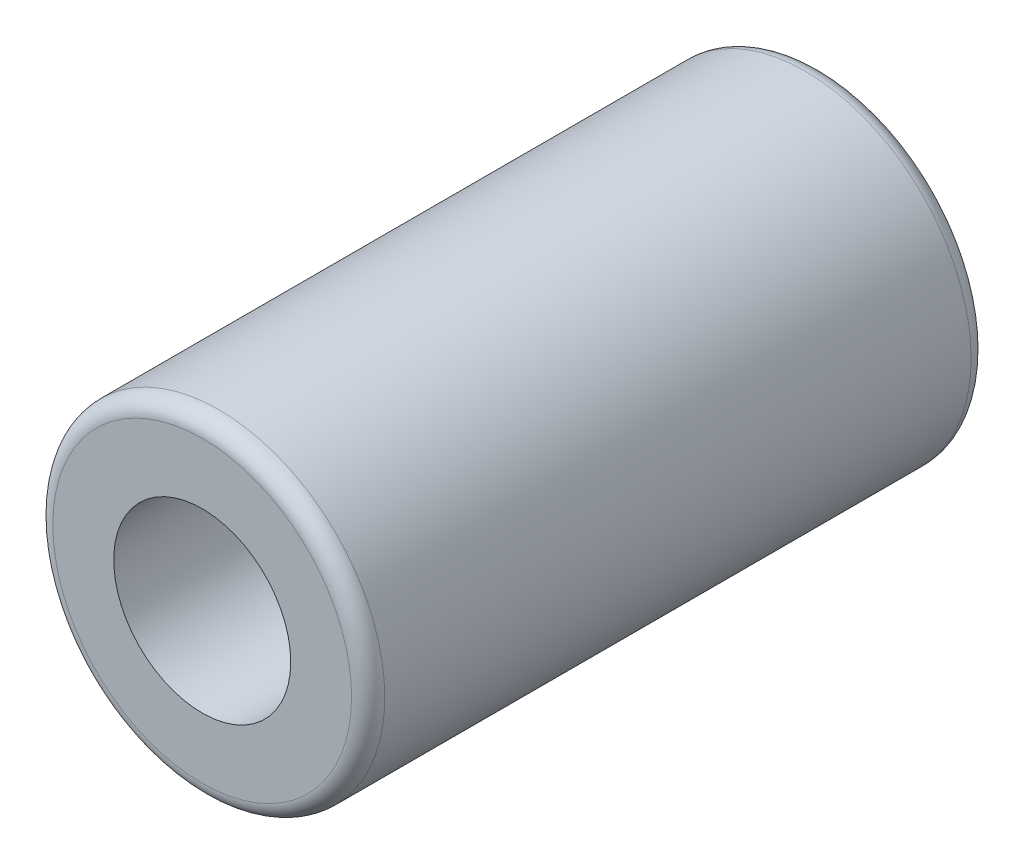
ISO-10303-21;
HEADER;
FILE_DESCRIPTION(('STEP AP214'),'2;1');
FILE_NAME('part.step','',(''),(''),'','','');
FILE_SCHEMA(('AUTOMOTIVE_DESIGN { 1 0 10303 214 1 1 1 1 }'));
ENDSEC;
DATA;
#1=APPLICATION_CONTEXT('core data for automotive mechanical design processes');
#2=APPLICATION_PROTOCOL_DEFINITION('international standard','automotive_design',2000,#1);
#3=PRODUCT_CONTEXT('',#1,'mechanical');
#4=PRODUCT('Part','Part','',(#3));
#5=PRODUCT_RELATED_PRODUCT_CATEGORY('part','',(#4));
#6=PRODUCT_DEFINITION_FORMATION('','',#4);
#7=PRODUCT_DEFINITION_CONTEXT('part definition',#1,'design');
#8=PRODUCT_DEFINITION('design','',#6,#7);
#9=PRODUCT_DEFINITION_SHAPE('','',#8);
#10=(LENGTH_UNIT() NAMED_UNIT(*) SI_UNIT(.MILLI.,.METRE.));
#11=(NAMED_UNIT(*) PLANE_ANGLE_UNIT() SI_UNIT($,.RADIAN.));
#12=(NAMED_UNIT(*) SI_UNIT($,.STERADIAN.) SOLID_ANGLE_UNIT());
#13=UNCERTAINTY_MEASURE_WITH_UNIT(LENGTH_MEASURE(1.E-05),#10,'distance_accuracy_value','');
#14=(GEOMETRIC_REPRESENTATION_CONTEXT(3) GLOBAL_UNCERTAINTY_ASSIGNED_CONTEXT((#13)) GLOBAL_UNIT_ASSIGNED_CONTEXT((#10,
#11,#12)) REPRESENTATION_CONTEXT('',''));
#15=CARTESIAN_POINT('',(0.,0.,0.));
#16=DIRECTION('',(0.,0.,1.));
#17=DIRECTION('',(1.,0.,0.));
#18=AXIS2_PLACEMENT_3D('',#15,#16,#17);
#19=CARTESIAN_POINT('',(0.,0.,11.2));
#20=DIRECTION('',(0.,0.,1.));
#21=DIRECTION('',(1.,0.,0.));
#22=AXIS2_PLACEMENT_3D('',#19,#20,#21);
#23=PLANE('',#22);
#24=CARTESIAN_POINT('',(0.,0.,11.2));
#25=DIRECTION('',(0.,0.,1.));
#26=DIRECTION('',(1.,0.,0.));
#27=AXIS2_PLACEMENT_3D('',#24,#25,#26);
#28=CIRCLE('',#27,2.7);
#29=CARTESIAN_POINT('',(2.7,0.,11.2));
#30=VERTEX_POINT('',#29);
#31=EDGE_CURVE('E10',#30,#30,#28,.T.);
#32=ORIENTED_EDGE('',*,*,#31,.T.);
#33=EDGE_LOOP('',(#32));
#34=FACE_BOUND('',#33,.T.);
#35=CARTESIAN_POINT('',(0.,0.,11.2));
#36=DIRECTION('',(0.,0.,1.));
#37=DIRECTION('',(1.,0.,0.));
#38=AXIS2_PLACEMENT_3D('',#35,#36,#37);
#39=CIRCLE('',#38,1.6);
#40=CARTESIAN_POINT('',(1.6,0.,11.2));
#41=VERTEX_POINT('',#40);
#42=EDGE_CURVE('E50',#41,#41,#39,.T.);
#43=ORIENTED_EDGE('',*,*,#42,.F.);
#44=EDGE_LOOP('',(#43));
#45=FACE_BOUND('',#44,.T.);
#46=ADVANCED_FACE('F30',(#34,#45),#23,.T.);
#47=CARTESIAN_POINT('',(0.,0.,0.));
#48=DIRECTION('',(0.,0.,1.));
#49=DIRECTION('',(1.,0.,0.));
#50=AXIS2_PLACEMENT_3D('',#47,#48,#49);
#51=PLANE('',#50);
#52=CARTESIAN_POINT('',(0.,0.,0.));
#53=DIRECTION('',(0.,0.,1.));
#54=DIRECTION('',(1.,0.,0.));
#55=AXIS2_PLACEMENT_3D('',#52,#53,#54);
#56=CIRCLE('',#55,2.7);
#57=CARTESIAN_POINT('',(2.7,0.,0.));
#58=VERTEX_POINT('',#57);
#59=EDGE_CURVE('E37',#58,#58,#56,.F.);
#60=ORIENTED_EDGE('',*,*,#59,.T.);
#61=EDGE_LOOP('',(#60));
#62=FACE_BOUND('',#61,.T.);
#63=CARTESIAN_POINT('',(0.,0.,0.));
#64=DIRECTION('',(0.,0.,1.));
#65=DIRECTION('',(1.,0.,0.));
#66=AXIS2_PLACEMENT_3D('',#63,#64,#65);
#67=CIRCLE('',#66,1.6);
#68=CARTESIAN_POINT('',(1.6,0.,0.));
#69=VERTEX_POINT('',#68);
#70=EDGE_CURVE('E51',#69,#69,#67,.T.);
#71=ORIENTED_EDGE('',*,*,#70,.T.);
#72=EDGE_LOOP('',(#71));
#73=FACE_BOUND('',#72,.T.);
#74=ADVANCED_FACE('F61',(#62,#73),#51,.F.);
#75=CARTESIAN_POINT('',(0.,0.,11.2));
#76=DIRECTION('',(0.,0.,-1.));
#77=DIRECTION('',(-1.,0.,0.));
#78=AXIS2_PLACEMENT_3D('',#75,#76,#77);
#79=CYLINDRICAL_SURFACE('',#78,3.);
#80=CARTESIAN_POINT('',(0.,0.,0.3));
#81=DIRECTION('',(0.,0.,1.));
#82=DIRECTION('',(1.,0.,0.));
#83=AXIS2_PLACEMENT_3D('',#80,#81,#82);
#84=CIRCLE('',#83,3.);
#85=CARTESIAN_POINT('',(3.,0.,0.3));
#86=VERTEX_POINT('',#85);
#87=EDGE_CURVE('E41',#86,#86,#84,.T.);
#88=ORIENTED_EDGE('',*,*,#87,.T.);
#89=EDGE_LOOP('',(#88));
#90=FACE_BOUND('',#89,.T.);
#91=CARTESIAN_POINT('',(0.,0.,10.9));
#92=DIRECTION('',(0.,0.,1.));
#93=DIRECTION('',(1.,0.,0.));
#94=AXIS2_PLACEMENT_3D('',#91,#92,#93);
#95=CIRCLE('',#94,3.);
#96=CARTESIAN_POINT('',(3.,0.,10.9));
#97=VERTEX_POINT('',#96);
#98=EDGE_CURVE('E45',#97,#97,#95,.F.);
#99=ORIENTED_EDGE('',*,*,#98,.T.);
#100=EDGE_LOOP('',(#99));
#101=FACE_BOUND('',#100,.T.);
#102=ADVANCED_FACE('F66',(#90,#101),#79,.T.);
#103=CARTESIAN_POINT('',(0.,0.,11.2));
#104=DIRECTION('',(0.,0.,-1.));
#105=DIRECTION('',(-1.,0.,0.));
#106=AXIS2_PLACEMENT_3D('',#103,#104,#105);
#107=CYLINDRICAL_SURFACE('',#106,1.6);
#108=ORIENTED_EDGE('',*,*,#42,.T.);
#109=EDGE_LOOP('',(#108));
#110=FACE_BOUND('',#109,.T.);
#111=ORIENTED_EDGE('',*,*,#70,.F.);
#112=EDGE_LOOP('',(#111));
#113=FACE_BOUND('',#112,.T.);
#114=ADVANCED_FACE('F57',(#110,#113),#107,.F.);
#115=CARTESIAN_POINT('',(0.,0.,0.3));
#116=DIRECTION('',(0.,0.,1.));
#117=DIRECTION('',(1.,0.,0.));
#118=AXIS2_PLACEMENT_3D('',#115,#116,#117);
#119=TOROIDAL_SURFACE('',#118,2.7,0.3);
#120=ORIENTED_EDGE('',*,*,#59,.F.);
#121=EDGE_LOOP('',(#120));
#122=FACE_BOUND('',#121,.T.);
#123=ORIENTED_EDGE('',*,*,#87,.F.);
#124=EDGE_LOOP('',(#123));
#125=FACE_BOUND('',#124,.T.);
#126=ADVANCED_FACE('F72',(#122,#125),#119,.T.);
#127=CARTESIAN_POINT('',(0.,0.,10.9));
#128=DIRECTION('',(0.,0.,1.));
#129=DIRECTION('',(1.,0.,0.));
#130=AXIS2_PLACEMENT_3D('',#127,#128,#129);
#131=TOROIDAL_SURFACE('',#130,2.7,0.3);
#132=ORIENTED_EDGE('',*,*,#98,.F.);
#133=EDGE_LOOP('',(#132));
#134=FACE_BOUND('',#133,.T.);
#135=ORIENTED_EDGE('',*,*,#31,.F.);
#136=EDGE_LOOP('',(#135));
#137=FACE_BOUND('',#136,.T.);
#138=ADVANCED_FACE('F32',(#134,#137),#131,.T.);
#139=CLOSED_SHELL('',(#46,#74,#102,#114,#126,#138));
#140=MANIFOLD_SOLID_BREP('B2',#139);
#141=ADVANCED_BREP_SHAPE_REPRESENTATION('',(#18,#140),#14);
#142=SHAPE_DEFINITION_REPRESENTATION(#9,#141);
ENDSEC;
END-ISO-10303-21;
